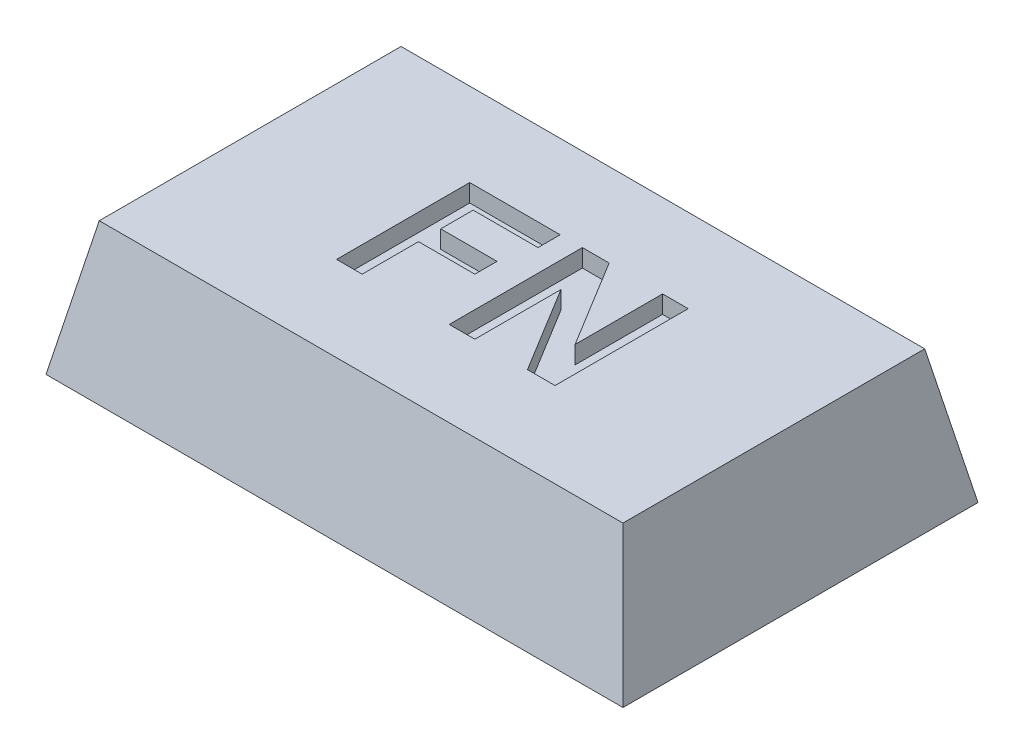
ISO-10303-21;
HEADER;
FILE_DESCRIPTION(('STEP AP214'),'2;1');
FILE_NAME('part.step','',(''),(''),'','','');
FILE_SCHEMA(('AUTOMOTIVE_DESIGN { 1 0 10303 214 1 1 1 1 }'));
ENDSEC;
DATA;
#1=APPLICATION_CONTEXT('core data for automotive mechanical design processes');
#2=APPLICATION_PROTOCOL_DEFINITION('international standard','automotive_design',2000,#1);
#3=PRODUCT_CONTEXT('',#1,'mechanical');
#4=PRODUCT('Part','Part','',(#3));
#5=PRODUCT_RELATED_PRODUCT_CATEGORY('part','',(#4));
#6=PRODUCT_DEFINITION_FORMATION('','',#4);
#7=PRODUCT_DEFINITION_CONTEXT('part definition',#1,'design');
#8=PRODUCT_DEFINITION('design','',#6,#7);
#9=PRODUCT_DEFINITION_SHAPE('','',#8);
#10=(LENGTH_UNIT() NAMED_UNIT(*) SI_UNIT(.MILLI.,.METRE.));
#11=(NAMED_UNIT(*) PLANE_ANGLE_UNIT() SI_UNIT($,.RADIAN.));
#12=(NAMED_UNIT(*) SI_UNIT($,.STERADIAN.) SOLID_ANGLE_UNIT());
#13=UNCERTAINTY_MEASURE_WITH_UNIT(LENGTH_MEASURE(1.E-05),#10,'distance_accuracy_value','');
#14=(GEOMETRIC_REPRESENTATION_CONTEXT(3) GLOBAL_UNCERTAINTY_ASSIGNED_CONTEXT((#13)) GLOBAL_UNIT_ASSIGNED_CONTEXT((#10,
#11,#12)) REPRESENTATION_CONTEXT('',''));
#15=CARTESIAN_POINT('',(0.,0.,0.));
#16=DIRECTION('',(0.,0.,1.));
#17=DIRECTION('',(1.,0.,0.));
#18=AXIS2_PLACEMENT_3D('',#15,#16,#17);
#19=CARTESIAN_POINT('',(0.,3.,0.));
#20=DIRECTION('',(0.,-1.,0.));
#21=DIRECTION('',(0.,0.,-1.));
#22=AXIS2_PLACEMENT_3D('',#19,#20,#21);
#23=PLANE('',#22);
#24=DIRECTION('',(-1.,0.,0.));
#25=VECTOR('',#24,1.);
#26=CARTESIAN_POINT('',(7.14412232211871,3.,-2.5185363973986));
#27=LINE('',#26,#25);
#28=CARTESIAN_POINT('',(7.14412232211871,3.,-2.5185363973986));
#29=VERTEX_POINT('',#28);
#30=CARTESIAN_POINT('',(6.56719924519563,3.,-2.5185363973986));
#31=VERTEX_POINT('',#30);
#32=EDGE_CURVE('E67',#29,#31,#27,.T.);
#33=ORIENTED_EDGE('',*,*,#32,.T.);
#34=DIRECTION('',(0.,0.,-1.));
#35=VECTOR('',#34,1.);
#36=CARTESIAN_POINT('',(6.56719924519563,3.,-2.5185363973986));
#37=LINE('',#36,#35);
#38=CARTESIAN_POINT('',(6.56719924519563,3.,-5.5185363973986));
#39=VERTEX_POINT('',#38);
#40=EDGE_CURVE('E330',#31,#39,#37,.T.);
#41=ORIENTED_EDGE('',*,*,#40,.T.);
#42=DIRECTION('',(1.,0.,0.));
#43=VECTOR('',#42,1.);
#44=CARTESIAN_POINT('',(6.56719924519563,3.,-5.5185363973986));
#45=LINE('',#44,#43);
#46=CARTESIAN_POINT('',(7.16996366827256,3.,-5.5185363973986));
#47=VERTEX_POINT('',#46);
#48=EDGE_CURVE('E326',#39,#47,#45,.T.);
#49=ORIENTED_EDGE('',*,*,#48,.T.);
#50=DIRECTION('',(0.521323795742145,0.,0.853358951434274));
#51=VECTOR('',#50,1.);
#52=CARTESIAN_POINT('',(7.16996366827256,3.,-5.5185363973986));
#53=LINE('',#52,#51);
#54=CARTESIAN_POINT('',(8.37489155288794,3.,-3.54618062816783));
#55=VERTEX_POINT('',#54);
#56=EDGE_CURVE('E322',#47,#55,#53,.T.);
#57=ORIENTED_EDGE('',*,*,#56,.T.);
#58=DIRECTION('',(0.,0.,-1.));
#59=VECTOR('',#58,1.);
#60=CARTESIAN_POINT('',(8.37489155288794,3.,-3.54618062816783));
#61=LINE('',#60,#59);
#62=CARTESIAN_POINT('',(8.37489155288794,3.,-5.5185363973986));
#63=VERTEX_POINT('',#62);
#64=EDGE_CURVE('E318',#55,#63,#61,.T.);
#65=ORIENTED_EDGE('',*,*,#64,.T.);
#66=DIRECTION('',(1.,0.,0.));
#67=VECTOR('',#66,1.);
#68=CARTESIAN_POINT('',(8.37489155288794,3.,-5.5185363973986));
#69=LINE('',#68,#67);
#70=CARTESIAN_POINT('',(8.95181462981102,3.,-5.5185363973986));
#71=VERTEX_POINT('',#70);
#72=EDGE_CURVE('E314',#63,#71,#69,.T.);
#73=ORIENTED_EDGE('',*,*,#72,.T.);
#74=DIRECTION('',(0.,0.,1.));
#75=VECTOR('',#74,1.);
#76=CARTESIAN_POINT('',(8.95181462981102,3.,-5.5185363973986));
#77=LINE('',#76,#75);
#78=CARTESIAN_POINT('',(8.95181462981102,3.,-2.5185363973986));
#79=VERTEX_POINT('',#78);
#80=EDGE_CURVE('E310',#71,#79,#77,.T.);
#81=ORIENTED_EDGE('',*,*,#80,.T.);
#82=DIRECTION('',(-1.,0.,0.));
#83=VECTOR('',#82,1.);
#84=CARTESIAN_POINT('',(8.95181462981102,3.,-2.5185363973986));
#85=LINE('',#84,#83);
#86=CARTESIAN_POINT('',(8.33042039904179,3.,-2.5185363973986));
#87=VERTEX_POINT('',#86);
#88=EDGE_CURVE('E306',#79,#87,#85,.T.);
#89=ORIENTED_EDGE('',*,*,#88,.T.);
#90=DIRECTION('',(-0.521471380338422,0.,-0.853268773299445));
#91=VECTOR('',#90,1.);
#92=CARTESIAN_POINT('',(8.33042039904179,3.,-2.5185363973986));
#93=LINE('',#92,#91);
#94=CARTESIAN_POINT('',(7.14412232211871,3.,-4.45964216662937));
#95=VERTEX_POINT('',#94);
#96=EDGE_CURVE('E301',#87,#95,#93,.T.);
#97=ORIENTED_EDGE('',*,*,#96,.T.);
#98=DIRECTION('',(0.,0.,1.));
#99=VECTOR('',#98,1.);
#100=CARTESIAN_POINT('',(7.14412232211871,3.,-4.45964216662937));
#101=LINE('',#100,#99);
#102=EDGE_CURVE('E297',#95,#29,#101,.T.);
#103=ORIENTED_EDGE('',*,*,#102,.T.);
#104=EDGE_LOOP('',(#33,#41,#49,#57,#65,#73,#81,#89,#97,#103));
#105=FACE_BOUND('',#104,.T.);
#106=DIRECTION('',(-1.,0.,0.));
#107=VECTOR('',#106,1.);
#108=CARTESIAN_POINT('',(13.000055,3.,-0.6));
#109=LINE('',#108,#107);
#110=CARTESIAN_POINT('',(12.4,3.,-0.6));
#111=VERTEX_POINT('',#110);
#112=CARTESIAN_POINT('',(0.6,3.,-0.6));
#113=VERTEX_POINT('',#112);
#114=EDGE_CURVE('E393',#111,#113,#109,.T.);
#115=ORIENTED_EDGE('',*,*,#114,.F.);
#116=DIRECTION('',(0.,0.,1.));
#117=VECTOR('',#116,1.);
#118=CARTESIAN_POINT('',(12.4,3.,-8.));
#119=LINE('',#118,#117);
#120=CARTESIAN_POINT('',(12.4,3.,-7.4));
#121=VERTEX_POINT('',#120);
#122=EDGE_CURVE('E403',#121,#111,#119,.T.);
#123=ORIENTED_EDGE('',*,*,#122,.F.);
#124=DIRECTION('',(-1.,0.,0.));
#125=VECTOR('',#124,1.);
#126=CARTESIAN_POINT('',(13.000055,3.,-7.4));
#127=LINE('',#126,#125);
#128=CARTESIAN_POINT('',(0.599999999999997,3.,-7.4));
#129=VERTEX_POINT('',#128);
#130=EDGE_CURVE('E389',#121,#129,#127,.T.);
#131=ORIENTED_EDGE('',*,*,#130,.T.);
#132=DIRECTION('',(0.,0.,1.));
#133=VECTOR('',#132,1.);
#134=CARTESIAN_POINT('',(0.6,3.,-8.));
#135=LINE('',#134,#133);
#136=EDGE_CURVE('E409',#129,#113,#135,.T.);
#137=ORIENTED_EDGE('',*,*,#136,.T.);
#138=EDGE_LOOP('',(#115,#123,#131,#137));
#139=FACE_BOUND('',#138,.T.);
#140=DIRECTION('',(-1.,0.,0.));
#141=VECTOR('',#140,1.);
#142=CARTESIAN_POINT('',(4.60566078365717,3.,-2.5185363973986));
#143=LINE('',#142,#141);
#144=CARTESIAN_POINT('',(4.60566078365717,3.,-2.5185363973986));
#145=VERTEX_POINT('',#144);
#146=CARTESIAN_POINT('',(4.0287377067341,3.,-2.5185363973986));
#147=VERTEX_POINT('',#146);
#148=EDGE_CURVE('E59',#145,#147,#143,.T.);
#149=ORIENTED_EDGE('',*,*,#148,.T.);
#150=DIRECTION('',(0.,0.,-1.));
#151=VECTOR('',#150,1.);
#152=CARTESIAN_POINT('',(4.0287377067341,3.,-2.5185363973986));
#153=LINE('',#152,#151);
#154=CARTESIAN_POINT('',(4.0287377067341,3.,-5.5185363973986));
#155=VERTEX_POINT('',#154);
#156=EDGE_CURVE('E252',#147,#155,#153,.T.);
#157=ORIENTED_EDGE('',*,*,#156,.T.);
#158=DIRECTION('',(1.,0.,0.));
#159=VECTOR('',#158,1.);
#160=CARTESIAN_POINT('',(4.0287377067341,3.,-5.5185363973986));
#161=LINE('',#160,#159);
#162=CARTESIAN_POINT('',(6.06719924519563,3.,-5.5185363973986));
#163=VERTEX_POINT('',#162);
#164=EDGE_CURVE('E948',#155,#163,#161,.T.);
#165=ORIENTED_EDGE('',*,*,#164,.T.);
#166=DIRECTION('',(0.,0.,1.));
#167=VECTOR('',#166,1.);
#168=CARTESIAN_POINT('',(6.06719924519563,3.,-5.5185363973986));
#169=LINE('',#168,#167);
#170=CARTESIAN_POINT('',(6.06719924519563,3.,-5.0185363973986));
#171=VERTEX_POINT('',#170);
#172=EDGE_CURVE('E950',#163,#171,#169,.T.);
#173=ORIENTED_EDGE('',*,*,#172,.T.);
#174=DIRECTION('',(-1.,0.,0.));
#175=VECTOR('',#174,1.);
#176=CARTESIAN_POINT('',(6.06719924519563,3.,-5.0185363973986));
#177=LINE('',#176,#175);
#178=CARTESIAN_POINT('',(4.60566078365717,3.,-5.0185363973986));
#179=VERTEX_POINT('',#178);
#180=EDGE_CURVE('E955',#171,#179,#177,.T.);
#181=ORIENTED_EDGE('',*,*,#180,.T.);
#182=DIRECTION('',(0.,0.,1.));
#183=VECTOR('',#182,1.);
#184=CARTESIAN_POINT('',(4.60566078365717,3.,-5.0185363973986));
#185=LINE('',#184,#183);
#186=CARTESIAN_POINT('',(4.60566078365717,3.,-4.28776716662937));
#187=VERTEX_POINT('',#186);
#188=EDGE_CURVE('E965',#179,#187,#185,.T.);
#189=ORIENTED_EDGE('',*,*,#188,.T.);
#190=DIRECTION('',(1.,0.,0.));
#191=VECTOR('',#190,1.);
#192=CARTESIAN_POINT('',(4.60566078365717,3.,-4.28776716662937));
#193=LINE('',#192,#191);
#194=CARTESIAN_POINT('',(5.87489155288794,3.,-4.28776716662937));
#195=VERTEX_POINT('',#194);
#196=EDGE_CURVE('E920',#187,#195,#193,.T.);
#197=ORIENTED_EDGE('',*,*,#196,.T.);
#198=DIRECTION('',(0.,0.,1.));
#199=VECTOR('',#198,1.);
#200=CARTESIAN_POINT('',(5.87489155288794,3.,-4.28776716662937));
#201=LINE('',#200,#199);
#202=CARTESIAN_POINT('',(5.87489155288794,3.,-3.78776716662937));
#203=VERTEX_POINT('',#202);
#204=EDGE_CURVE('E915',#195,#203,#201,.T.);
#205=ORIENTED_EDGE('',*,*,#204,.T.);
#206=DIRECTION('',(-1.,0.,0.));
#207=VECTOR('',#206,1.);
#208=CARTESIAN_POINT('',(5.87489155288794,3.,-3.78776716662937));
#209=LINE('',#208,#207);
#210=CARTESIAN_POINT('',(4.60566078365717,3.,-3.78776716662937));
#211=VERTEX_POINT('',#210);
#212=EDGE_CURVE('E909',#203,#211,#209,.T.);
#213=ORIENTED_EDGE('',*,*,#212,.T.);
#214=DIRECTION('',(0.,0.,1.));
#215=VECTOR('',#214,1.);
#216=CARTESIAN_POINT('',(4.60566078365717,3.,-3.78776716662937));
#217=LINE('',#216,#215);
#218=EDGE_CURVE('E248',#211,#145,#217,.T.);
#219=ORIENTED_EDGE('',*,*,#218,.T.);
#220=EDGE_LOOP('',(#149,#157,#165,#173,#181,#189,#197,#205,#213,#219));
#221=FACE_BOUND('',#220,.T.);
#222=ADVANCED_FACE('F43',(#105,#139,#221),#23,.F.);
#223=CARTESIAN_POINT('',(13.,0.,-8.));
#224=DIRECTION('',(-0.98058067569092,-0.196116135138184,0.));
#225=DIRECTION('',(0.196116135138184,-0.98058067569092,0.));
#226=AXIS2_PLACEMENT_3D('',#223,#224,#225);
#227=PLANE('',#226);
#228=DIRECTION('',(-0.192450089729875,0.962250448649376,-0.192450089729875));
#229=VECTOR('',#228,1.);
#230=CARTESIAN_POINT('',(12.7037037037037,1.48148148148148,-0.296296296296295));
#231=LINE('',#230,#229);
#232=CARTESIAN_POINT('',(13.0000245,0.,0.));
#233=VERTEX_POINT('',#232);
#234=EDGE_CURVE('E400',#233,#111,#231,.T.);
#235=ORIENTED_EDGE('',*,*,#234,.F.);
#236=DIRECTION('',(0.,0.,-1.));
#237=VECTOR('',#236,1.);
#238=CARTESIAN_POINT('',(13.,0.,0.));
#239=LINE('',#238,#237);
#240=CARTESIAN_POINT('',(13.0000025,0.,-8.));
#241=VERTEX_POINT('',#240);
#242=EDGE_CURVE('E429',#233,#241,#239,.T.);
#243=ORIENTED_EDGE('',*,*,#242,.T.);
#244=DIRECTION('',(0.192450089729875,-0.962250448649376,-0.192450089729875));
#245=VECTOR('',#244,1.);
#246=CARTESIAN_POINT('',(13.,0.,-8.));
#247=LINE('',#246,#245);
#248=EDGE_CURVE('E396',#121,#241,#247,.T.);
#249=ORIENTED_EDGE('',*,*,#248,.F.);
#250=ORIENTED_EDGE('',*,*,#122,.T.);
#251=EDGE_LOOP('',(#235,#243,#249,#250));
#252=FACE_BOUND('',#251,.T.);
#253=ADVANCED_FACE('F508',(#252),#227,.F.);
#254=CARTESIAN_POINT('',(0.,0.,-8.));
#255=DIRECTION('',(0.98058067569092,-0.196116135138184,0.));
#256=DIRECTION('',(0.196116135138184,0.98058067569092,0.));
#257=AXIS2_PLACEMENT_3D('',#254,#255,#256);
#258=PLANE('',#257);
#259=DIRECTION('',(-0.192450089729875,-0.962250448649376,0.192450089729875));
#260=VECTOR('',#259,1.);
#261=CARTESIAN_POINT('',(0.296296296296296,1.48148148148148,-0.296296296296295));
#262=LINE('',#261,#260);
#263=CARTESIAN_POINT('',(-2.5E-06,0.,0.));
#264=VERTEX_POINT('',#263);
#265=EDGE_CURVE('E435',#113,#264,#262,.T.);
#266=ORIENTED_EDGE('',*,*,#265,.F.);
#267=ORIENTED_EDGE('',*,*,#136,.F.);
#268=DIRECTION('',(0.192450089729875,0.962250448649376,0.192450089729875));
#269=VECTOR('',#268,1.);
#270=CARTESIAN_POINT('',(0.,0.,-8.));
#271=LINE('',#270,#269);
#272=CARTESIAN_POINT('',(0.,0.,-8.));
#273=VERTEX_POINT('',#272);
#274=EDGE_CURVE('E420',#273,#129,#271,.T.);
#275=ORIENTED_EDGE('',*,*,#274,.F.);
#276=DIRECTION('',(0.,0.,1.));
#277=VECTOR('',#276,1.);
#278=CARTESIAN_POINT('',(0.,0.,0.));
#279=LINE('',#278,#277);
#280=EDGE_CURVE('E460',#273,#264,#279,.T.);
#281=ORIENTED_EDGE('',*,*,#280,.T.);
#282=EDGE_LOOP('',(#266,#267,#275,#281));
#283=FACE_BOUND('',#282,.T.);
#284=ADVANCED_FACE('F505',(#283),#258,.F.);
#285=CARTESIAN_POINT('',(0.,0.,0.));
#286=DIRECTION('',(0.,-1.,0.));
#287=DIRECTION('',(0.,0.,-1.));
#288=AXIS2_PLACEMENT_3D('',#285,#286,#287);
#289=PLANE('',#288);
#290=DIRECTION('',(0.,0.,-1.));
#291=VECTOR('',#290,1.);
#292=CARTESIAN_POINT('',(2.500011,0.,-8.));
#293=LINE('',#292,#291);
#294=CARTESIAN_POINT('',(2.500011,0.,-6.9));
#295=VERTEX_POINT('',#294);
#296=CARTESIAN_POINT('',(2.500011,0.,-8.));
#297=VERTEX_POINT('',#296);
#298=EDGE_CURVE('E254',#295,#297,#293,.T.);
#299=ORIENTED_EDGE('',*,*,#298,.F.);
#300=DIRECTION('',(-1.,0.,0.));
#301=VECTOR('',#300,1.);
#302=CARTESIAN_POINT('',(2.500011,0.,-6.9));
#303=LINE('',#302,#301);
#304=CARTESIAN_POINT('',(10.500011,0.,-6.9));
#305=VERTEX_POINT('',#304);
#306=EDGE_CURVE('E370',#305,#295,#303,.T.);
#307=ORIENTED_EDGE('',*,*,#306,.F.);
#308=DIRECTION('',(0.,0.,1.));
#309=VECTOR('',#308,1.);
#310=CARTESIAN_POINT('',(10.500011,0.,-8.));
#311=LINE('',#310,#309);
#312=CARTESIAN_POINT('',(10.500011,0.,-8.));
#313=VERTEX_POINT('',#312);
#314=EDGE_CURVE('E378',#313,#305,#311,.T.);
#315=ORIENTED_EDGE('',*,*,#314,.F.);
#316=DIRECTION('',(-1.,0.,0.));
#317=VECTOR('',#316,1.);
#318=CARTESIAN_POINT('',(0.,0.,-8.));
#319=LINE('',#318,#317);
#320=EDGE_CURVE('E416',#241,#313,#319,.T.);
#321=ORIENTED_EDGE('',*,*,#320,.F.);
#322=ORIENTED_EDGE('',*,*,#242,.F.);
#323=DIRECTION('',(1.,0.,0.));
#324=VECTOR('',#323,1.);
#325=CARTESIAN_POINT('',(0.,0.,0.));
#326=LINE('',#325,#324);
#327=EDGE_CURVE('E476',#264,#233,#326,.T.);
#328=ORIENTED_EDGE('',*,*,#327,.F.);
#329=ORIENTED_EDGE('',*,*,#280,.F.);
#330=EDGE_CURVE('E421',#297,#273,#319,.T.);
#331=ORIENTED_EDGE('',*,*,#330,.F.);
#332=EDGE_LOOP('',(#299,#307,#315,#321,#322,#328,#329,#331));
#333=FACE_BOUND('',#332,.T.);
#334=CARTESIAN_POINT('',(6.50000125,0.,-3.75));
#335=DIRECTION('',(0.,-1.,0.));
#336=DIRECTION('',(0.,0.,-1.));
#337=AXIS2_PLACEMENT_3D('',#334,#335,#336);
#338=CIRCLE('',#337,1.75);
#339=CARTESIAN_POINT('',(6.50000125,0.,-5.5));
#340=VERTEX_POINT('',#339);
#341=EDGE_CURVE('E373',#340,#340,#338,.T.);
#342=ORIENTED_EDGE('',*,*,#341,.F.);
#343=EDGE_LOOP('',(#342));
#344=FACE_BOUND('',#343,.T.);
#345=ADVANCED_FACE('F455',(#333,#344),#289,.T.);
#346=CARTESIAN_POINT('',(13.000055,3.,-7.4));
#347=DIRECTION('',(0.,0.196116135138184,-0.98058067569092));
#348=DIRECTION('',(0.,0.98058067569092,0.196116135138184));
#349=AXIS2_PLACEMENT_3D('',#346,#347,#348);
#350=PLANE('',#349);
#351=ORIENTED_EDGE('',*,*,#248,.T.);
#352=ORIENTED_EDGE('',*,*,#320,.T.);
#353=DIRECTION('',(1.,0.,0.));
#354=VECTOR('',#353,1.);
#355=CARTESIAN_POINT('',(2.500011,0.,-8.));
#356=LINE('',#355,#354);
#357=EDGE_CURVE('E260',#297,#313,#356,.T.);
#358=ORIENTED_EDGE('',*,*,#357,.F.);
#359=ORIENTED_EDGE('',*,*,#330,.T.);
#360=ORIENTED_EDGE('',*,*,#274,.T.);
#361=ORIENTED_EDGE('',*,*,#130,.F.);
#362=EDGE_LOOP('',(#351,#352,#358,#359,#360,#361));
#363=FACE_BOUND('',#362,.T.);
#364=ADVANCED_FACE('F463',(#363),#350,.T.);
#365=CARTESIAN_POINT('',(13.000055,0.,0.));
#366=DIRECTION('',(0.,0.196116135138184,0.98058067569092));
#367=DIRECTION('',(0.,-0.98058067569092,0.196116135138184));
#368=AXIS2_PLACEMENT_3D('',#365,#366,#367);
#369=PLANE('',#368);
#370=ORIENTED_EDGE('',*,*,#234,.T.);
#371=ORIENTED_EDGE('',*,*,#114,.T.);
#372=ORIENTED_EDGE('',*,*,#265,.T.);
#373=ORIENTED_EDGE('',*,*,#327,.T.);
#374=EDGE_LOOP('',(#370,#371,#372,#373));
#375=FACE_BOUND('',#374,.T.);
#376=ADVANCED_FACE('F509',(#375),#369,.T.);
#377=CARTESIAN_POINT('',(6.50000125,0.4,-3.75));
#378=DIRECTION('',(0.,-1.,0.));
#379=DIRECTION('',(0.,0.,-1.));
#380=AXIS2_PLACEMENT_3D('',#377,#378,#379);
#381=CYLINDRICAL_SURFACE('',#380,1.75);
#382=CARTESIAN_POINT('',(6.50000125,0.4,-3.75));
#383=DIRECTION('',(0.,-1.,0.));
#384=DIRECTION('',(0.,0.,-1.));
#385=AXIS2_PLACEMENT_3D('',#382,#383,#384);
#386=CIRCLE('',#385,1.75);
#387=CARTESIAN_POINT('',(6.50000125,0.4,-5.5));
#388=VERTEX_POINT('',#387);
#389=EDGE_CURVE('E385',#388,#388,#386,.T.);
#390=ORIENTED_EDGE('',*,*,#389,.F.);
#391=EDGE_LOOP('',(#390));
#392=FACE_BOUND('',#391,.T.);
#393=ORIENTED_EDGE('',*,*,#341,.T.);
#394=EDGE_LOOP('',(#393));
#395=FACE_BOUND('',#394,.T.);
#396=ADVANCED_FACE('F511',(#392,#395),#381,.F.);
#397=CARTESIAN_POINT('',(6.50000125,0.4,-3.75));
#398=DIRECTION('',(0.,-1.,0.));
#399=DIRECTION('',(0.,0.,-1.));
#400=AXIS2_PLACEMENT_3D('',#397,#398,#399);
#401=PLANE('',#400);
#402=ORIENTED_EDGE('',*,*,#389,.T.);
#403=EDGE_LOOP('',(#402));
#404=FACE_BOUND('',#403,.T.);
#405=ADVANCED_FACE('F517',(#404),#401,.T.);
#406=CARTESIAN_POINT('',(2.500011,-2.,-8.));
#407=DIRECTION('',(0.,0.,1.));
#408=DIRECTION('',(1.,0.,0.));
#409=AXIS2_PLACEMENT_3D('',#406,#407,#408);
#410=PLANE('',#409);
#411=ORIENTED_EDGE('',*,*,#357,.T.);
#412=CARTESIAN_POINT('',(7.03590938486225,2.,-8.));
#413=DIRECTION('',(0.,0.,1.));
#414=DIRECTION('',(1.,0.,0.));
#415=AXIS2_PLACEMENT_3D('',#412,#413,#414);
#416=CIRCLE('',#415,4.);
#417=CARTESIAN_POINT('',(7.03590938486225,-2.,-8.));
#418=VERTEX_POINT('',#417);
#419=EDGE_CURVE('E11',#313,#418,#416,.F.);
#420=ORIENTED_EDGE('',*,*,#419,.T.);
#421=DIRECTION('',(1.,0.,0.));
#422=VECTOR('',#421,1.);
#423=CARTESIAN_POINT('',(2.500011,-2.,-8.));
#424=LINE('',#423,#422);
#425=CARTESIAN_POINT('',(5.96411261513776,-2.,-8.));
#426=VERTEX_POINT('',#425);
#427=EDGE_CURVE('E365',#426,#418,#424,.T.);
#428=ORIENTED_EDGE('',*,*,#427,.F.);
#429=CARTESIAN_POINT('',(5.96411261513776,2.,-8.));
#430=DIRECTION('',(0.,0.,1.));
#431=DIRECTION('',(1.,0.,0.));
#432=AXIS2_PLACEMENT_3D('',#429,#430,#431);
#433=CIRCLE('',#432,4.);
#434=EDGE_CURVE('E52',#426,#297,#433,.F.);
#435=ORIENTED_EDGE('',*,*,#434,.T.);
#436=EDGE_LOOP('',(#411,#420,#428,#435));
#437=FACE_BOUND('',#436,.T.);
#438=ADVANCED_FACE('F448',(#437),#410,.F.);
#439=CARTESIAN_POINT('',(2.500011,-2.,-6.9));
#440=DIRECTION('',(0.,0.,-1.));
#441=DIRECTION('',(-1.,0.,0.));
#442=AXIS2_PLACEMENT_3D('',#439,#440,#441);
#443=PLANE('',#442);
#444=DIRECTION('',(-1.,0.,0.));
#445=VECTOR('',#444,1.);
#446=CARTESIAN_POINT('',(2.500011,-2.,-6.9));
#447=LINE('',#446,#445);
#448=CARTESIAN_POINT('',(7.03590938486225,-2.,-6.9));
#449=VERTEX_POINT('',#448);
#450=CARTESIAN_POINT('',(5.96411261513776,-2.,-6.9));
#451=VERTEX_POINT('',#450);
#452=EDGE_CURVE('E369',#449,#451,#447,.T.);
#453=ORIENTED_EDGE('',*,*,#452,.F.);
#454=CARTESIAN_POINT('',(7.03590938486225,2.,-6.9));
#455=DIRECTION('',(0.,0.,-1.));
#456=DIRECTION('',(-1.,0.,0.));
#457=AXIS2_PLACEMENT_3D('',#454,#455,#456);
#458=CIRCLE('',#457,4.);
#459=EDGE_CURVE('E442',#449,#305,#458,.F.);
#460=ORIENTED_EDGE('',*,*,#459,.T.);
#461=ORIENTED_EDGE('',*,*,#306,.T.);
#462=CARTESIAN_POINT('',(5.96411261513776,2.,-6.9));
#463=DIRECTION('',(0.,0.,-1.));
#464=DIRECTION('',(-1.,0.,0.));
#465=AXIS2_PLACEMENT_3D('',#462,#463,#464);
#466=CIRCLE('',#465,4.);
#467=EDGE_CURVE('E439',#295,#451,#466,.F.);
#468=ORIENTED_EDGE('',*,*,#467,.T.);
#469=EDGE_LOOP('',(#453,#460,#461,#468));
#470=FACE_BOUND('',#469,.T.);
#471=ADVANCED_FACE('F468',(#470),#443,.F.);
#472=CARTESIAN_POINT('',(0.,-2.,0.));
#473=DIRECTION('',(0.,1.,0.));
#474=DIRECTION('',(0.,0.,1.));
#475=AXIS2_PLACEMENT_3D('',#472,#473,#474);
#476=PLANE('',#475);
#477=ORIENTED_EDGE('',*,*,#427,.T.);
#478=DIRECTION('',(0.,0.,1.));
#479=VECTOR('',#478,1.);
#480=CARTESIAN_POINT('',(7.03590938486226,-2.,0.));
#481=LINE('',#480,#479);
#482=EDGE_CURVE('E434',#418,#449,#481,.T.);
#483=ORIENTED_EDGE('',*,*,#482,.T.);
#484=ORIENTED_EDGE('',*,*,#452,.T.);
#485=DIRECTION('',(0.,0.,-1.));
#486=VECTOR('',#485,1.);
#487=CARTESIAN_POINT('',(5.96411261513776,-2.,0.));
#488=LINE('',#487,#486);
#489=EDGE_CURVE('E430',#451,#426,#488,.T.);
#490=ORIENTED_EDGE('',*,*,#489,.T.);
#491=EDGE_LOOP('',(#477,#483,#484,#490));
#492=FACE_BOUND('',#491,.T.);
#493=ADVANCED_FACE('F470',(#492),#476,.F.);
#494=CARTESIAN_POINT('',(7.03590938486225,2.,-7.99999999999999));
#495=DIRECTION('',(0.,0.,1.));
#496=DIRECTION('',(1.,0.,0.));
#497=AXIS2_PLACEMENT_3D('',#494,#495,#496);
#498=CYLINDRICAL_SURFACE('',#497,4.);
#499=ORIENTED_EDGE('',*,*,#419,.F.);
#500=ORIENTED_EDGE('',*,*,#314,.T.);
#501=ORIENTED_EDGE('',*,*,#459,.F.);
#502=ORIENTED_EDGE('',*,*,#482,.F.);
#503=EDGE_LOOP('',(#499,#500,#501,#502));
#504=FACE_BOUND('',#503,.T.);
#505=ADVANCED_FACE('F473',(#504),#498,.T.);
#506=CARTESIAN_POINT('',(5.96411261513776,2.,-8.));
#507=DIRECTION('',(0.,0.,-1.));
#508=DIRECTION('',(-1.,0.,0.));
#509=AXIS2_PLACEMENT_3D('',#506,#507,#508);
#510=CYLINDRICAL_SURFACE('',#509,4.);
#511=ORIENTED_EDGE('',*,*,#467,.F.);
#512=ORIENTED_EDGE('',*,*,#298,.T.);
#513=ORIENTED_EDGE('',*,*,#434,.F.);
#514=ORIENTED_EDGE('',*,*,#489,.F.);
#515=EDGE_LOOP('',(#511,#512,#513,#514));
#516=FACE_BOUND('',#515,.T.);
#517=ADVANCED_FACE('F45',(#516),#510,.T.);
#518=CARTESIAN_POINT('',(7.14412232211871,2.6,-2.5185363973986));
#519=DIRECTION('',(0.,0.,-1.));
#520=DIRECTION('',(-1.,0.,0.));
#521=AXIS2_PLACEMENT_3D('',#518,#519,#520);
#522=PLANE('',#521);
#523=ORIENTED_EDGE('',*,*,#32,.F.);
#524=DIRECTION('',(0.,1.,0.));
#525=VECTOR('',#524,1.);
#526=CARTESIAN_POINT('',(7.14412232211871,2.6,-2.5185363973986));
#527=LINE('',#526,#525);
#528=CARTESIAN_POINT('',(7.14412232211871,2.6,-2.5185363973986));
#529=VERTEX_POINT('',#528);
#530=EDGE_CURVE('E293',#529,#29,#527,.T.);
#531=ORIENTED_EDGE('',*,*,#530,.F.);
#532=DIRECTION('',(-1.,0.,0.));
#533=VECTOR('',#532,1.);
#534=CARTESIAN_POINT('',(7.14412232211871,2.6,-2.5185363973986));
#535=LINE('',#534,#533);
#536=CARTESIAN_POINT('',(6.56719924519563,2.6,-2.5185363973986));
#537=VERTEX_POINT('',#536);
#538=EDGE_CURVE('E302',#529,#537,#535,.T.);
#539=ORIENTED_EDGE('',*,*,#538,.T.);
#540=DIRECTION('',(0.,1.,0.));
#541=VECTOR('',#540,1.);
#542=CARTESIAN_POINT('',(6.56719924519563,2.6,-2.5185363973986));
#543=LINE('',#542,#541);
#544=EDGE_CURVE('E266',#537,#31,#543,.T.);
#545=ORIENTED_EDGE('',*,*,#544,.T.);
#546=EDGE_LOOP('',(#523,#531,#539,#545));
#547=FACE_BOUND('',#546,.T.);
#548=ADVANCED_FACE('F536',(#547),#522,.T.);
#549=CARTESIAN_POINT('',(6.56719924519563,2.6,-2.5185363973986));
#550=DIRECTION('',(1.,0.,0.));
#551=DIRECTION('',(0.,0.,-1.));
#552=AXIS2_PLACEMENT_3D('',#549,#550,#551);
#553=PLANE('',#552);
#554=ORIENTED_EDGE('',*,*,#40,.F.);
#555=ORIENTED_EDGE('',*,*,#544,.F.);
#556=DIRECTION('',(0.,0.,-1.));
#557=VECTOR('',#556,1.);
#558=CARTESIAN_POINT('',(6.56719924519563,2.6,-2.5185363973986));
#559=LINE('',#558,#557);
#560=CARTESIAN_POINT('',(6.56719924519563,2.6,-5.5185363973986));
#561=VERTEX_POINT('',#560);
#562=EDGE_CURVE('E359',#537,#561,#559,.T.);
#563=ORIENTED_EDGE('',*,*,#562,.T.);
#564=DIRECTION('',(0.,1.,0.));
#565=VECTOR('',#564,1.);
#566=CARTESIAN_POINT('',(6.56719924519563,2.6,-5.5185363973986));
#567=LINE('',#566,#565);
#568=EDGE_CURVE('E269',#561,#39,#567,.T.);
#569=ORIENTED_EDGE('',*,*,#568,.T.);
#570=EDGE_LOOP('',(#554,#555,#563,#569));
#571=FACE_BOUND('',#570,.T.);
#572=ADVANCED_FACE('F599',(#571),#553,.T.);
#573=CARTESIAN_POINT('',(6.56719924519563,2.6,-5.5185363973986));
#574=DIRECTION('',(0.,0.,1.));
#575=DIRECTION('',(1.,0.,0.));
#576=AXIS2_PLACEMENT_3D('',#573,#574,#575);
#577=PLANE('',#576);
#578=ORIENTED_EDGE('',*,*,#48,.F.);
#579=ORIENTED_EDGE('',*,*,#568,.F.);
#580=DIRECTION('',(1.,0.,0.));
#581=VECTOR('',#580,1.);
#582=CARTESIAN_POINT('',(6.56719924519563,2.6,-5.5185363973986));
#583=LINE('',#582,#581);
#584=CARTESIAN_POINT('',(7.16996366827256,2.6,-5.5185363973986));
#585=VERTEX_POINT('',#584);
#586=EDGE_CURVE('E356',#561,#585,#583,.T.);
#587=ORIENTED_EDGE('',*,*,#586,.T.);
#588=DIRECTION('',(0.,1.,0.));
#589=VECTOR('',#588,1.);
#590=CARTESIAN_POINT('',(7.16996366827256,2.6,-5.5185363973986));
#591=LINE('',#590,#589);
#592=EDGE_CURVE('E272',#585,#47,#591,.T.);
#593=ORIENTED_EDGE('',*,*,#592,.T.);
#594=EDGE_LOOP('',(#578,#579,#587,#593));
#595=FACE_BOUND('',#594,.T.);
#596=ADVANCED_FACE('F609',(#595),#577,.T.);
#597=CARTESIAN_POINT('',(7.16996366827256,2.6,-5.5185363973986));
#598=DIRECTION('',(-0.853358951434273,0.,0.521323795742145));
#599=DIRECTION('',(0.521323795742145,0.,0.853358951434273));
#600=AXIS2_PLACEMENT_3D('',#597,#598,#599);
#601=PLANE('',#600);
#602=ORIENTED_EDGE('',*,*,#56,.F.);
#603=ORIENTED_EDGE('',*,*,#592,.F.);
#604=DIRECTION('',(0.521323795742145,0.,0.853358951434274));
#605=VECTOR('',#604,1.);
#606=CARTESIAN_POINT('',(7.16996366827256,2.6,-5.5185363973986));
#607=LINE('',#606,#605);
#608=CARTESIAN_POINT('',(8.37489155288794,2.6,-3.54618062816783));
#609=VERTEX_POINT('',#608);
#610=EDGE_CURVE('E353',#585,#609,#607,.T.);
#611=ORIENTED_EDGE('',*,*,#610,.T.);
#612=DIRECTION('',(0.,1.,0.));
#613=VECTOR('',#612,1.);
#614=CARTESIAN_POINT('',(8.37489155288794,2.6,-3.54618062816783));
#615=LINE('',#614,#613);
#616=EDGE_CURVE('E275',#609,#55,#615,.T.);
#617=ORIENTED_EDGE('',*,*,#616,.T.);
#618=EDGE_LOOP('',(#602,#603,#611,#617));
#619=FACE_BOUND('',#618,.T.);
#620=ADVANCED_FACE('F620',(#619),#601,.T.);
#621=CARTESIAN_POINT('',(8.37489155288794,2.6,-3.54618062816783));
#622=DIRECTION('',(1.,0.,0.));
#623=DIRECTION('',(0.,0.,-1.));
#624=AXIS2_PLACEMENT_3D('',#621,#622,#623);
#625=PLANE('',#624);
#626=ORIENTED_EDGE('',*,*,#64,.F.);
#627=ORIENTED_EDGE('',*,*,#616,.F.);
#628=DIRECTION('',(0.,0.,-1.));
#629=VECTOR('',#628,1.);
#630=CARTESIAN_POINT('',(8.37489155288794,2.6,-3.54618062816783));
#631=LINE('',#630,#629);
#632=CARTESIAN_POINT('',(8.37489155288794,2.6,-5.5185363973986));
#633=VERTEX_POINT('',#632);
#634=EDGE_CURVE('E350',#609,#633,#631,.T.);
#635=ORIENTED_EDGE('',*,*,#634,.T.);
#636=DIRECTION('',(0.,1.,0.));
#637=VECTOR('',#636,1.);
#638=CARTESIAN_POINT('',(8.37489155288794,2.6,-5.5185363973986));
#639=LINE('',#638,#637);
#640=EDGE_CURVE('E278',#633,#63,#639,.T.);
#641=ORIENTED_EDGE('',*,*,#640,.T.);
#642=EDGE_LOOP('',(#626,#627,#635,#641));
#643=FACE_BOUND('',#642,.T.);
#644=ADVANCED_FACE('F631',(#643),#625,.T.);
#645=CARTESIAN_POINT('',(8.37489155288794,2.6,-5.5185363973986));
#646=DIRECTION('',(0.,0.,1.));
#647=DIRECTION('',(1.,0.,0.));
#648=AXIS2_PLACEMENT_3D('',#645,#646,#647);
#649=PLANE('',#648);
#650=ORIENTED_EDGE('',*,*,#72,.F.);
#651=ORIENTED_EDGE('',*,*,#640,.F.);
#652=DIRECTION('',(1.,0.,0.));
#653=VECTOR('',#652,1.);
#654=CARTESIAN_POINT('',(8.37489155288794,2.6,-5.5185363973986));
#655=LINE('',#654,#653);
#656=CARTESIAN_POINT('',(8.95181462981102,2.6,-5.5185363973986));
#657=VERTEX_POINT('',#656);
#658=EDGE_CURVE('E347',#633,#657,#655,.T.);
#659=ORIENTED_EDGE('',*,*,#658,.T.);
#660=DIRECTION('',(0.,1.,0.));
#661=VECTOR('',#660,1.);
#662=CARTESIAN_POINT('',(8.95181462981102,2.6,-5.5185363973986));
#663=LINE('',#662,#661);
#664=EDGE_CURVE('E281',#657,#71,#663,.T.);
#665=ORIENTED_EDGE('',*,*,#664,.T.);
#666=EDGE_LOOP('',(#650,#651,#659,#665));
#667=FACE_BOUND('',#666,.T.);
#668=ADVANCED_FACE('F642',(#667),#649,.T.);
#669=CARTESIAN_POINT('',(8.95181462981102,2.6,-5.5185363973986));
#670=DIRECTION('',(-1.,0.,0.));
#671=DIRECTION('',(0.,0.,1.));
#672=AXIS2_PLACEMENT_3D('',#669,#670,#671);
#673=PLANE('',#672);
#674=ORIENTED_EDGE('',*,*,#80,.F.);
#675=ORIENTED_EDGE('',*,*,#664,.F.);
#676=DIRECTION('',(0.,0.,1.));
#677=VECTOR('',#676,1.);
#678=CARTESIAN_POINT('',(8.95181462981102,2.6,-5.5185363973986));
#679=LINE('',#678,#677);
#680=CARTESIAN_POINT('',(8.95181462981102,2.6,-2.5185363973986));
#681=VERTEX_POINT('',#680);
#682=EDGE_CURVE('E344',#657,#681,#679,.T.);
#683=ORIENTED_EDGE('',*,*,#682,.T.);
#684=DIRECTION('',(0.,1.,0.));
#685=VECTOR('',#684,1.);
#686=CARTESIAN_POINT('',(8.95181462981102,2.6,-2.5185363973986));
#687=LINE('',#686,#685);
#688=EDGE_CURVE('E284',#681,#79,#687,.T.);
#689=ORIENTED_EDGE('',*,*,#688,.T.);
#690=EDGE_LOOP('',(#674,#675,#683,#689));
#691=FACE_BOUND('',#690,.T.);
#692=ADVANCED_FACE('F653',(#691),#673,.T.);
#693=CARTESIAN_POINT('',(8.95181462981102,2.6,-2.5185363973986));
#694=DIRECTION('',(0.,0.,-1.));
#695=DIRECTION('',(-1.,0.,0.));
#696=AXIS2_PLACEMENT_3D('',#693,#694,#695);
#697=PLANE('',#696);
#698=ORIENTED_EDGE('',*,*,#88,.F.);
#699=ORIENTED_EDGE('',*,*,#688,.F.);
#700=DIRECTION('',(-1.,0.,0.));
#701=VECTOR('',#700,1.);
#702=CARTESIAN_POINT('',(8.95181462981102,2.6,-2.5185363973986));
#703=LINE('',#702,#701);
#704=CARTESIAN_POINT('',(8.33042039904179,2.6,-2.5185363973986));
#705=VERTEX_POINT('',#704);
#706=EDGE_CURVE('E341',#681,#705,#703,.T.);
#707=ORIENTED_EDGE('',*,*,#706,.T.);
#708=DIRECTION('',(0.,1.,0.));
#709=VECTOR('',#708,1.);
#710=CARTESIAN_POINT('',(8.33042039904179,2.6,-2.5185363973986));
#711=LINE('',#710,#709);
#712=EDGE_CURVE('E287',#705,#87,#711,.T.);
#713=ORIENTED_EDGE('',*,*,#712,.T.);
#714=EDGE_LOOP('',(#698,#699,#707,#713));
#715=FACE_BOUND('',#714,.T.);
#716=ADVANCED_FACE('F664',(#715),#697,.T.);
#717=CARTESIAN_POINT('',(8.33042039904179,2.6,-2.5185363973986));
#718=DIRECTION('',(0.853268773299446,0.,-0.521471380338422));
#719=DIRECTION('',(-0.521471380338422,0.,-0.853268773299446));
#720=AXIS2_PLACEMENT_3D('',#717,#718,#719);
#721=PLANE('',#720);
#722=ORIENTED_EDGE('',*,*,#96,.F.);
#723=ORIENTED_EDGE('',*,*,#712,.F.);
#724=DIRECTION('',(-0.521471380338422,0.,-0.853268773299445));
#725=VECTOR('',#724,1.);
#726=CARTESIAN_POINT('',(8.33042039904179,2.6,-2.5185363973986));
#727=LINE('',#726,#725);
#728=CARTESIAN_POINT('',(7.14412232211871,2.6,-4.45964216662937));
#729=VERTEX_POINT('',#728);
#730=EDGE_CURVE('E338',#705,#729,#727,.T.);
#731=ORIENTED_EDGE('',*,*,#730,.T.);
#732=DIRECTION('',(0.,1.,0.));
#733=VECTOR('',#732,1.);
#734=CARTESIAN_POINT('',(7.14412232211871,2.6,-4.45964216662937));
#735=LINE('',#734,#733);
#736=EDGE_CURVE('E290',#729,#95,#735,.T.);
#737=ORIENTED_EDGE('',*,*,#736,.T.);
#738=EDGE_LOOP('',(#722,#723,#731,#737));
#739=FACE_BOUND('',#738,.T.);
#740=ADVANCED_FACE('F675',(#739),#721,.T.);
#741=CARTESIAN_POINT('',(7.14412232211871,2.6,-4.45964216662937));
#742=DIRECTION('',(-1.,0.,0.));
#743=DIRECTION('',(0.,0.,1.));
#744=AXIS2_PLACEMENT_3D('',#741,#742,#743);
#745=PLANE('',#744);
#746=ORIENTED_EDGE('',*,*,#102,.F.);
#747=ORIENTED_EDGE('',*,*,#736,.F.);
#748=DIRECTION('',(0.,0.,1.));
#749=VECTOR('',#748,1.);
#750=CARTESIAN_POINT('',(7.14412232211871,2.6,-4.45964216662937));
#751=LINE('',#750,#749);
#752=EDGE_CURVE('E296',#729,#529,#751,.T.);
#753=ORIENTED_EDGE('',*,*,#752,.T.);
#754=ORIENTED_EDGE('',*,*,#530,.T.);
#755=EDGE_LOOP('',(#746,#747,#753,#754));
#756=FACE_BOUND('',#755,.T.);
#757=ADVANCED_FACE('F686',(#756),#745,.T.);
#758=CARTESIAN_POINT('',(0.,2.6,0.));
#759=DIRECTION('',(0.,-1.,0.));
#760=DIRECTION('',(0.,0.,-1.));
#761=AXIS2_PLACEMENT_3D('',#758,#759,#760);
#762=PLANE('',#761);
#763=ORIENTED_EDGE('',*,*,#538,.F.);
#764=ORIENTED_EDGE('',*,*,#752,.F.);
#765=ORIENTED_EDGE('',*,*,#730,.F.);
#766=ORIENTED_EDGE('',*,*,#706,.F.);
#767=ORIENTED_EDGE('',*,*,#682,.F.);
#768=ORIENTED_EDGE('',*,*,#658,.F.);
#769=ORIENTED_EDGE('',*,*,#634,.F.);
#770=ORIENTED_EDGE('',*,*,#610,.F.);
#771=ORIENTED_EDGE('',*,*,#586,.F.);
#772=ORIENTED_EDGE('',*,*,#562,.F.);
#773=EDGE_LOOP('',(#763,#764,#765,#766,#767,#768,#769,#770,#771,#772));
#774=FACE_BOUND('',#773,.T.);
#775=ADVANCED_FACE('F543',(#774),#762,.F.);
#776=CARTESIAN_POINT('',(4.60566078365717,2.6,-2.5185363973986));
#777=DIRECTION('',(0.,0.,-1.));
#778=DIRECTION('',(-1.,0.,0.));
#779=AXIS2_PLACEMENT_3D('',#776,#777,#778);
#780=PLANE('',#779);
#781=ORIENTED_EDGE('',*,*,#148,.F.);
#782=DIRECTION('',(0.,1.,0.));
#783=VECTOR('',#782,1.);
#784=CARTESIAN_POINT('',(4.60566078365717,2.6,-2.5185363973986));
#785=LINE('',#784,#783);
#786=CARTESIAN_POINT('',(4.60566078365717,2.6,-2.5185363973986));
#787=VERTEX_POINT('',#786);
#788=EDGE_CURVE('E246',#787,#145,#785,.T.);
#789=ORIENTED_EDGE('',*,*,#788,.F.);
#790=DIRECTION('',(-1.,0.,0.));
#791=VECTOR('',#790,1.);
#792=CARTESIAN_POINT('',(4.60566078365717,2.6,-2.5185363973986));
#793=LINE('',#792,#791);
#794=CARTESIAN_POINT('',(4.0287377067341,2.6,-2.5185363973986));
#795=VERTEX_POINT('',#794);
#796=EDGE_CURVE('E236',#787,#795,#793,.T.);
#797=ORIENTED_EDGE('',*,*,#796,.T.);
#798=DIRECTION('',(0.,1.,0.));
#799=VECTOR('',#798,1.);
#800=CARTESIAN_POINT('',(4.0287377067341,2.6,-2.5185363973986));
#801=LINE('',#800,#799);
#802=EDGE_CURVE('E245',#795,#147,#801,.T.);
#803=ORIENTED_EDGE('',*,*,#802,.T.);
#804=EDGE_LOOP('',(#781,#789,#797,#803));
#805=FACE_BOUND('',#804,.T.);
#806=ADVANCED_FACE('F244',(#805),#780,.T.);
#807=CARTESIAN_POINT('',(4.0287377067341,2.6,-2.5185363973986));
#808=DIRECTION('',(1.,0.,0.));
#809=DIRECTION('',(0.,0.,-1.));
#810=AXIS2_PLACEMENT_3D('',#807,#808,#809);
#811=PLANE('',#810);
#812=ORIENTED_EDGE('',*,*,#156,.F.);
#813=ORIENTED_EDGE('',*,*,#802,.F.);
#814=DIRECTION('',(0.,0.,-1.));
#815=VECTOR('',#814,1.);
#816=CARTESIAN_POINT('',(4.0287377067341,2.6,-2.5185363973986));
#817=LINE('',#816,#815);
#818=CARTESIAN_POINT('',(4.0287377067341,2.6,-5.5185363973986));
#819=VERTEX_POINT('',#818);
#820=EDGE_CURVE('E232',#795,#819,#817,.T.);
#821=ORIENTED_EDGE('',*,*,#820,.T.);
#822=DIRECTION('',(0.,1.,0.));
#823=VECTOR('',#822,1.);
#824=CARTESIAN_POINT('',(4.0287377067341,2.6,-5.5185363973986));
#825=LINE('',#824,#823);
#826=EDGE_CURVE('E255',#819,#155,#825,.T.);
#827=ORIENTED_EDGE('',*,*,#826,.T.);
#828=EDGE_LOOP('',(#812,#813,#821,#827));
#829=FACE_BOUND('',#828,.T.);
#830=ADVANCED_FACE('F250',(#829),#811,.T.);
#831=CARTESIAN_POINT('',(4.0287377067341,2.6,-5.5185363973986));
#832=DIRECTION('',(0.,0.,1.));
#833=DIRECTION('',(1.,0.,0.));
#834=AXIS2_PLACEMENT_3D('',#831,#832,#833);
#835=PLANE('',#834);
#836=ORIENTED_EDGE('',*,*,#164,.F.);
#837=ORIENTED_EDGE('',*,*,#826,.F.);
#838=DIRECTION('',(1.,0.,0.));
#839=VECTOR('',#838,1.);
#840=CARTESIAN_POINT('',(4.0287377067341,2.6,-5.5185363973986));
#841=LINE('',#840,#839);
#842=CARTESIAN_POINT('',(6.06719924519563,2.6,-5.5185363973986));
#843=VERTEX_POINT('',#842);
#844=EDGE_CURVE('E238',#819,#843,#841,.T.);
#845=ORIENTED_EDGE('',*,*,#844,.T.);
#846=DIRECTION('',(0.,1.,0.));
#847=VECTOR('',#846,1.);
#848=CARTESIAN_POINT('',(6.06719924519563,2.6,-5.5185363973986));
#849=LINE('',#848,#847);
#850=EDGE_CURVE('E262',#843,#163,#849,.T.);
#851=ORIENTED_EDGE('',*,*,#850,.T.);
#852=EDGE_LOOP('',(#836,#837,#845,#851));
#853=FACE_BOUND('',#852,.T.);
#854=ADVANCED_FACE('F724',(#853),#835,.T.);
#855=CARTESIAN_POINT('',(6.06719924519563,2.6,-5.5185363973986));
#856=DIRECTION('',(-1.,0.,0.));
#857=DIRECTION('',(0.,0.,1.));
#858=AXIS2_PLACEMENT_3D('',#855,#856,#857);
#859=PLANE('',#858);
#860=ORIENTED_EDGE('',*,*,#172,.F.);
#861=ORIENTED_EDGE('',*,*,#850,.F.);
#862=DIRECTION('',(0.,0.,1.));
#863=VECTOR('',#862,1.);
#864=CARTESIAN_POINT('',(6.06719924519563,2.6,-5.5185363973986));
#865=LINE('',#864,#863);
#866=CARTESIAN_POINT('',(6.06719924519563,2.6,-5.0185363973986));
#867=VERTEX_POINT('',#866);
#868=EDGE_CURVE('E995',#843,#867,#865,.T.);
#869=ORIENTED_EDGE('',*,*,#868,.T.);
#870=DIRECTION('',(0.,1.,0.));
#871=VECTOR('',#870,1.);
#872=CARTESIAN_POINT('',(6.06719924519563,2.6,-5.0185363973986));
#873=LINE('',#872,#871);
#874=EDGE_CURVE('E941',#867,#171,#873,.T.);
#875=ORIENTED_EDGE('',*,*,#874,.T.);
#876=EDGE_LOOP('',(#860,#861,#869,#875));
#877=FACE_BOUND('',#876,.T.);
#878=ADVANCED_FACE('F734',(#877),#859,.T.);
#879=CARTESIAN_POINT('',(6.06719924519563,2.6,-5.0185363973986));
#880=DIRECTION('',(0.,0.,-1.));
#881=DIRECTION('',(-1.,0.,0.));
#882=AXIS2_PLACEMENT_3D('',#879,#880,#881);
#883=PLANE('',#882);
#884=ORIENTED_EDGE('',*,*,#180,.F.);
#885=ORIENTED_EDGE('',*,*,#874,.F.);
#886=DIRECTION('',(-1.,0.,0.));
#887=VECTOR('',#886,1.);
#888=CARTESIAN_POINT('',(6.06719924519563,2.6,-5.0185363973986));
#889=LINE('',#888,#887);
#890=CARTESIAN_POINT('',(4.60566078365717,2.6,-5.0185363973986));
#891=VERTEX_POINT('',#890);
#892=EDGE_CURVE('E992',#867,#891,#889,.T.);
#893=ORIENTED_EDGE('',*,*,#892,.T.);
#894=DIRECTION('',(0.,1.,0.));
#895=VECTOR('',#894,1.);
#896=CARTESIAN_POINT('',(4.60566078365717,2.6,-5.0185363973986));
#897=LINE('',#896,#895);
#898=EDGE_CURVE('E938',#891,#179,#897,.T.);
#899=ORIENTED_EDGE('',*,*,#898,.T.);
#900=EDGE_LOOP('',(#884,#885,#893,#899));
#901=FACE_BOUND('',#900,.T.);
#902=ADVANCED_FACE('F745',(#901),#883,.T.);
#903=CARTESIAN_POINT('',(4.60566078365717,2.6,-5.0185363973986));
#904=DIRECTION('',(-1.,0.,0.));
#905=DIRECTION('',(0.,0.,1.));
#906=AXIS2_PLACEMENT_3D('',#903,#904,#905);
#907=PLANE('',#906);
#908=ORIENTED_EDGE('',*,*,#188,.F.);
#909=ORIENTED_EDGE('',*,*,#898,.F.);
#910=DIRECTION('',(0.,0.,1.));
#911=VECTOR('',#910,1.);
#912=CARTESIAN_POINT('',(4.60566078365717,2.6,-5.0185363973986));
#913=LINE('',#912,#911);
#914=CARTESIAN_POINT('',(4.60566078365717,2.6,-4.28776716662937));
#915=VERTEX_POINT('',#914);
#916=EDGE_CURVE('E989',#891,#915,#913,.T.);
#917=ORIENTED_EDGE('',*,*,#916,.T.);
#918=DIRECTION('',(0.,1.,0.));
#919=VECTOR('',#918,1.);
#920=CARTESIAN_POINT('',(4.60566078365717,2.6,-4.28776716662937));
#921=LINE('',#920,#919);
#922=EDGE_CURVE('E935',#915,#187,#921,.T.);
#923=ORIENTED_EDGE('',*,*,#922,.T.);
#924=EDGE_LOOP('',(#908,#909,#917,#923));
#925=FACE_BOUND('',#924,.T.);
#926=ADVANCED_FACE('F756',(#925),#907,.T.);
#927=CARTESIAN_POINT('',(4.60566078365717,2.6,-4.28776716662937));
#928=DIRECTION('',(0.,0.,1.));
#929=DIRECTION('',(1.,0.,0.));
#930=AXIS2_PLACEMENT_3D('',#927,#928,#929);
#931=PLANE('',#930);
#932=ORIENTED_EDGE('',*,*,#196,.F.);
#933=ORIENTED_EDGE('',*,*,#922,.F.);
#934=DIRECTION('',(1.,0.,0.));
#935=VECTOR('',#934,1.);
#936=CARTESIAN_POINT('',(4.60566078365717,2.6,-4.28776716662937));
#937=LINE('',#936,#935);
#938=CARTESIAN_POINT('',(5.87489155288794,2.6,-4.28776716662937));
#939=VERTEX_POINT('',#938);
#940=EDGE_CURVE('E974',#915,#939,#937,.T.);
#941=ORIENTED_EDGE('',*,*,#940,.T.);
#942=DIRECTION('',(0.,1.,0.));
#943=VECTOR('',#942,1.);
#944=CARTESIAN_POINT('',(5.87489155288794,2.6,-4.28776716662937));
#945=LINE('',#944,#943);
#946=EDGE_CURVE('E932',#939,#195,#945,.T.);
#947=ORIENTED_EDGE('',*,*,#946,.T.);
#948=EDGE_LOOP('',(#932,#933,#941,#947));
#949=FACE_BOUND('',#948,.T.);
#950=ADVANCED_FACE('F767',(#949),#931,.T.);
#951=CARTESIAN_POINT('',(5.87489155288794,2.6,-4.28776716662937));
#952=DIRECTION('',(-1.,0.,0.));
#953=DIRECTION('',(0.,0.,1.));
#954=AXIS2_PLACEMENT_3D('',#951,#952,#953);
#955=PLANE('',#954);
#956=ORIENTED_EDGE('',*,*,#204,.F.);
#957=ORIENTED_EDGE('',*,*,#946,.F.);
#958=DIRECTION('',(0.,0.,1.));
#959=VECTOR('',#958,1.);
#960=CARTESIAN_POINT('',(5.87489155288794,2.6,-4.28776716662937));
#961=LINE('',#960,#959);
#962=CARTESIAN_POINT('',(5.87489155288794,2.6,-3.78776716662937));
#963=VERTEX_POINT('',#962);
#964=EDGE_CURVE('E976',#939,#963,#961,.T.);
#965=ORIENTED_EDGE('',*,*,#964,.T.);
#966=DIRECTION('',(0.,1.,0.));
#967=VECTOR('',#966,1.);
#968=CARTESIAN_POINT('',(5.87489155288794,2.6,-3.78776716662937));
#969=LINE('',#968,#967);
#970=EDGE_CURVE('E929',#963,#203,#969,.T.);
#971=ORIENTED_EDGE('',*,*,#970,.T.);
#972=EDGE_LOOP('',(#956,#957,#965,#971));
#973=FACE_BOUND('',#972,.T.);
#974=ADVANCED_FACE('F778',(#973),#955,.T.);
#975=CARTESIAN_POINT('',(5.87489155288794,2.6,-3.78776716662937));
#976=DIRECTION('',(0.,0.,-1.));
#977=DIRECTION('',(-1.,0.,0.));
#978=AXIS2_PLACEMENT_3D('',#975,#976,#977);
#979=PLANE('',#978);
#980=ORIENTED_EDGE('',*,*,#212,.F.);
#981=ORIENTED_EDGE('',*,*,#970,.F.);
#982=DIRECTION('',(-1.,0.,0.));
#983=VECTOR('',#982,1.);
#984=CARTESIAN_POINT('',(5.87489155288794,2.6,-3.78776716662937));
#985=LINE('',#984,#983);
#986=CARTESIAN_POINT('',(4.60566078365717,2.6,-3.78776716662937));
#987=VERTEX_POINT('',#986);
#988=EDGE_CURVE('E978',#963,#987,#985,.T.);
#989=ORIENTED_EDGE('',*,*,#988,.T.);
#990=DIRECTION('',(0.,1.,0.));
#991=VECTOR('',#990,1.);
#992=CARTESIAN_POINT('',(4.60566078365717,2.6,-3.78776716662937));
#993=LINE('',#992,#991);
#994=EDGE_CURVE('E907',#987,#211,#993,.T.);
#995=ORIENTED_EDGE('',*,*,#994,.T.);
#996=EDGE_LOOP('',(#980,#981,#989,#995));
#997=FACE_BOUND('',#996,.T.);
#998=ADVANCED_FACE('F789',(#997),#979,.T.);
#999=CARTESIAN_POINT('',(4.60566078365717,2.6,-3.78776716662937));
#1000=DIRECTION('',(-1.,0.,0.));
#1001=DIRECTION('',(0.,0.,1.));
#1002=AXIS2_PLACEMENT_3D('',#999,#1000,#1001);
#1003=PLANE('',#1002);
#1004=ORIENTED_EDGE('',*,*,#218,.F.);
#1005=ORIENTED_EDGE('',*,*,#994,.F.);
#1006=DIRECTION('',(0.,0.,1.));
#1007=VECTOR('',#1006,1.);
#1008=CARTESIAN_POINT('',(4.60566078365717,2.6,-3.78776716662937));
#1009=LINE('',#1008,#1007);
#1010=EDGE_CURVE('E926',#987,#787,#1009,.T.);
#1011=ORIENTED_EDGE('',*,*,#1010,.T.);
#1012=ORIENTED_EDGE('',*,*,#788,.T.);
#1013=EDGE_LOOP('',(#1004,#1005,#1011,#1012));
#1014=FACE_BOUND('',#1013,.T.);
#1015=ADVANCED_FACE('F800',(#1014),#1003,.T.);
#1016=CARTESIAN_POINT('',(0.,2.6,0.));
#1017=DIRECTION('',(0.,-1.,0.));
#1018=DIRECTION('',(0.,0.,-1.));
#1019=AXIS2_PLACEMENT_3D('',#1016,#1017,#1018);
#1020=PLANE('',#1019);
#1021=ORIENTED_EDGE('',*,*,#796,.F.);
#1022=ORIENTED_EDGE('',*,*,#1010,.F.);
#1023=ORIENTED_EDGE('',*,*,#988,.F.);
#1024=ORIENTED_EDGE('',*,*,#964,.F.);
#1025=ORIENTED_EDGE('',*,*,#940,.F.);
#1026=ORIENTED_EDGE('',*,*,#916,.F.);
#1027=ORIENTED_EDGE('',*,*,#892,.F.);
#1028=ORIENTED_EDGE('',*,*,#868,.F.);
#1029=ORIENTED_EDGE('',*,*,#844,.F.);
#1030=ORIENTED_EDGE('',*,*,#820,.F.);
#1031=EDGE_LOOP('',(#1021,#1022,#1023,#1024,#1025,#1026,#1027,#1028,#1029,#1030));
#1032=FACE_BOUND('',#1031,.T.);
#1033=ADVANCED_FACE('F234',(#1032),#1020,.F.);
#1034=CLOSED_SHELL('',(#222,#253,#284,#345,#364,#376,#396,#405,#438,#471,#493,#505,#517,#548,
#572,#596,#620,#644,#668,#692,#716,#740,#757,#775,#806,#830,#854,#878,#902,#926,#950,#974,#998,
#1015,#1033));
#1035=MANIFOLD_SOLID_BREP('B2',#1034);
#1036=ADVANCED_BREP_SHAPE_REPRESENTATION('',(#18,#1035),#14);
#1037=SHAPE_DEFINITION_REPRESENTATION(#9,#1036);
ENDSEC;
END-ISO-10303-21;
